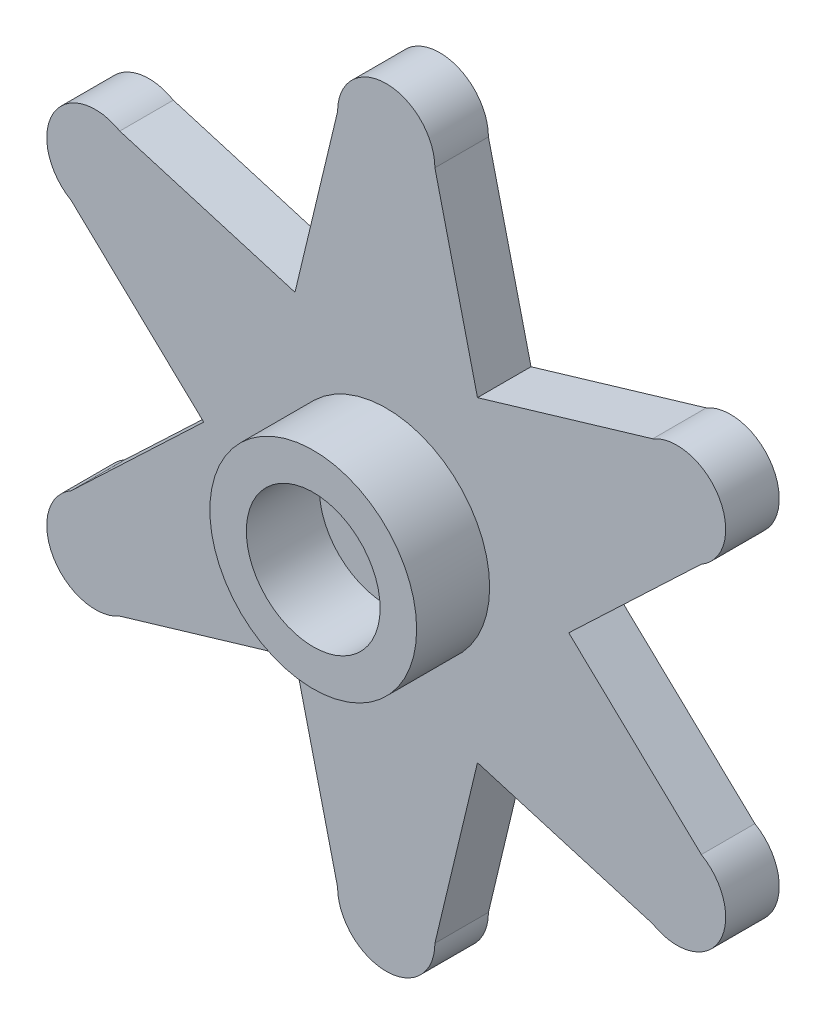
ISO-10303-21;
HEADER;
FILE_DESCRIPTION(('STEP AP214'),'2;1');
FILE_NAME('part.step','',(''),(''),'','','');
FILE_SCHEMA(('AUTOMOTIVE_DESIGN { 1 0 10303 214 1 1 1 1 }'));
ENDSEC;
DATA;
#1=APPLICATION_CONTEXT('core data for automotive mechanical design processes');
#2=APPLICATION_PROTOCOL_DEFINITION('international standard','automotive_design',2000,#1);
#3=PRODUCT_CONTEXT('',#1,'mechanical');
#4=PRODUCT('Part','Part','',(#3));
#5=PRODUCT_RELATED_PRODUCT_CATEGORY('part','',(#4));
#6=PRODUCT_DEFINITION_FORMATION('','',#4);
#7=PRODUCT_DEFINITION_CONTEXT('part definition',#1,'design');
#8=PRODUCT_DEFINITION('design','',#6,#7);
#9=PRODUCT_DEFINITION_SHAPE('','',#8);
#10=(LENGTH_UNIT() NAMED_UNIT(*) SI_UNIT(.MILLI.,.METRE.));
#11=(NAMED_UNIT(*) PLANE_ANGLE_UNIT() SI_UNIT($,.RADIAN.));
#12=(NAMED_UNIT(*) SI_UNIT($,.STERADIAN.) SOLID_ANGLE_UNIT());
#13=UNCERTAINTY_MEASURE_WITH_UNIT(LENGTH_MEASURE(1.E-05),#10,'distance_accuracy_value','');
#14=(GEOMETRIC_REPRESENTATION_CONTEXT(3) GLOBAL_UNCERTAINTY_ASSIGNED_CONTEXT((#13)) GLOBAL_UNIT_ASSIGNED_CONTEXT((#10,
#11,#12)) REPRESENTATION_CONTEXT('',''));
#15=CARTESIAN_POINT('',(0.,0.,0.));
#16=DIRECTION('',(0.,0.,1.));
#17=DIRECTION('',(1.,0.,0.));
#18=AXIS2_PLACEMENT_3D('',#15,#16,#17);
#19=CARTESIAN_POINT('',(11.9511505722253,-6.9,2.2));
#20=DIRECTION('',(0.,0.,-1.));
#21=DIRECTION('',(-1.,0.,0.));
#22=AXIS2_PLACEMENT_3D('',#19,#20,#21);
#23=CYLINDRICAL_SURFACE('',#22,2.);
#24=CARTESIAN_POINT('',(11.9511505722253,-6.9,0.));
#25=DIRECTION('',(0.,0.,-1.));
#26=DIRECTION('',(1.,0.,0.));
#27=AXIS2_PLACEMENT_3D('',#24,#25,#26);
#28=CIRCLE('',#27,2.);
#29=CARTESIAN_POINT('',(12.9511505722253,-5.16794919243113,0.));
#30=VERTEX_POINT('',#29);
#31=CARTESIAN_POINT('',(10.9511505722253,-8.63205080756889,0.));
#32=VERTEX_POINT('',#31);
#33=EDGE_CURVE('E224',#30,#32,#28,.T.);
#34=ORIENTED_EDGE('',*,*,#33,.F.);
#35=DIRECTION('',(0.,0.,-1.));
#36=VECTOR('',#35,1.);
#37=CARTESIAN_POINT('',(12.9511505722253,-5.16794919243113,2.2));
#38=LINE('',#37,#36);
#39=CARTESIAN_POINT('',(12.9511505722253,-5.16794919243113,2.2));
#40=VERTEX_POINT('',#39);
#41=EDGE_CURVE('E19',#40,#30,#38,.T.);
#42=ORIENTED_EDGE('',*,*,#41,.F.);
#43=CARTESIAN_POINT('',(11.9511505722253,-6.9,2.2));
#44=DIRECTION('',(0.,0.,-1.));
#45=DIRECTION('',(1.,0.,0.));
#46=AXIS2_PLACEMENT_3D('',#43,#44,#45);
#47=CIRCLE('',#46,2.);
#48=CARTESIAN_POINT('',(10.9511505722253,-8.63205080756889,2.2));
#49=VERTEX_POINT('',#48);
#50=EDGE_CURVE('E288',#40,#49,#47,.T.);
#51=ORIENTED_EDGE('',*,*,#50,.T.);
#52=DIRECTION('',(0.,0.,-1.));
#53=VECTOR('',#52,1.);
#54=CARTESIAN_POINT('',(10.9511505722253,-8.63205080756889,2.2));
#55=LINE('',#54,#53);
#56=EDGE_CURVE('E39',#49,#32,#55,.T.);
#57=ORIENTED_EDGE('',*,*,#56,.T.);
#58=EDGE_LOOP('',(#34,#42,#51,#57));
#59=FACE_BOUND('',#58,.T.);
#60=ADVANCED_FACE('F16',(#59),#23,.T.);
#61=CARTESIAN_POINT('',(10.2255752861126,-2.58397459621556,2.2));
#62=DIRECTION('',(-0.688004285822964,-0.725706623015964,0.));
#63=DIRECTION('',(0.725706623015964,-0.688004285822964,0.));
#64=AXIS2_PLACEMENT_3D('',#61,#62,#63);
#65=PLANE('',#64);
#66=DIRECTION('',(-0.725706623015964,0.688004285822964,0.));
#67=VECTOR('',#66,1.);
#68=CARTESIAN_POINT('',(10.2255752861126,-2.58397459621556,0.));
#69=LINE('',#68,#67);
#70=CARTESIAN_POINT('',(7.5,0.,0.));
#71=VERTEX_POINT('',#70);
#72=EDGE_CURVE('E227',#30,#71,#69,.T.);
#73=ORIENTED_EDGE('',*,*,#72,.T.);
#74=DIRECTION('',(0.,0.,-1.));
#75=VECTOR('',#74,1.);
#76=CARTESIAN_POINT('',(7.5,0.,2.2));
#77=LINE('',#76,#75);
#78=CARTESIAN_POINT('',(7.5,0.,2.2));
#79=VERTEX_POINT('',#78);
#80=EDGE_CURVE('E333',#79,#71,#77,.T.);
#81=ORIENTED_EDGE('',*,*,#80,.F.);
#82=DIRECTION('',(-0.725706623015964,0.688004285822964,0.));
#83=VECTOR('',#82,1.);
#84=CARTESIAN_POINT('',(10.2255752861126,-2.58397459621556,2.2));
#85=LINE('',#84,#83);
#86=EDGE_CURVE('E345',#40,#79,#85,.T.);
#87=ORIENTED_EDGE('',*,*,#86,.F.);
#88=ORIENTED_EDGE('',*,*,#41,.T.);
#89=EDGE_LOOP('',(#73,#81,#87,#88));
#90=FACE_BOUND('',#89,.T.);
#91=ADVANCED_FACE('F344',(#90),#65,.F.);
#92=CARTESIAN_POINT('',(10.2255752861126,2.58397459621556,2.2));
#93=DIRECTION('',(0.688004285822963,-0.725706623015964,0.));
#94=DIRECTION('',(0.725706623015964,0.688004285822963,0.));
#95=AXIS2_PLACEMENT_3D('',#92,#93,#94);
#96=PLANE('',#95);
#97=DIRECTION('',(-0.725706623015964,-0.688004285822963,0.));
#98=VECTOR('',#97,1.);
#99=CARTESIAN_POINT('',(10.2255752861126,2.58397459621556,0.));
#100=LINE('',#99,#98);
#101=CARTESIAN_POINT('',(12.9511505722253,5.16794919243113,0.));
#102=VERTEX_POINT('',#101);
#103=EDGE_CURVE('E232',#102,#71,#100,.T.);
#104=ORIENTED_EDGE('',*,*,#103,.F.);
#105=DIRECTION('',(0.,0.,-1.));
#106=VECTOR('',#105,1.);
#107=CARTESIAN_POINT('',(12.9511505722253,5.16794919243113,2.2));
#108=LINE('',#107,#106);
#109=CARTESIAN_POINT('',(12.9511505722253,5.16794919243113,2.2));
#110=VERTEX_POINT('',#109);
#111=EDGE_CURVE('E331',#110,#102,#108,.T.);
#112=ORIENTED_EDGE('',*,*,#111,.F.);
#113=DIRECTION('',(-0.725706623015964,-0.688004285822963,0.));
#114=VECTOR('',#113,1.);
#115=CARTESIAN_POINT('',(10.2255752861126,2.58397459621556,2.2));
#116=LINE('',#115,#114);
#117=EDGE_CURVE('E457',#110,#79,#116,.T.);
#118=ORIENTED_EDGE('',*,*,#117,.T.);
#119=ORIENTED_EDGE('',*,*,#80,.T.);
#120=EDGE_LOOP('',(#104,#112,#118,#119));
#121=FACE_BOUND('',#120,.T.);
#122=ADVANCED_FACE('F354',(#121),#96,.T.);
#123=CARTESIAN_POINT('',(11.9511505722253,6.9,2.2));
#124=DIRECTION('',(0.,0.,-1.));
#125=DIRECTION('',(-1.,0.,0.));
#126=AXIS2_PLACEMENT_3D('',#123,#124,#125);
#127=CYLINDRICAL_SURFACE('',#126,2.);
#128=CARTESIAN_POINT('',(11.9511505722253,6.9,0.));
#129=DIRECTION('',(0.,0.,1.));
#130=DIRECTION('',(1.,0.,0.));
#131=AXIS2_PLACEMENT_3D('',#128,#129,#130);
#132=CIRCLE('',#131,2.);
#133=CARTESIAN_POINT('',(10.9511505722253,8.63205080756888,0.));
#134=VERTEX_POINT('',#133);
#135=EDGE_CURVE('E236',#102,#134,#132,.T.);
#136=ORIENTED_EDGE('',*,*,#135,.T.);
#137=DIRECTION('',(0.,0.,-1.));
#138=VECTOR('',#137,1.);
#139=CARTESIAN_POINT('',(10.9511505722253,8.63205080756888,2.2));
#140=LINE('',#139,#138);
#141=CARTESIAN_POINT('',(10.9511505722253,8.63205080756888,2.2));
#142=VERTEX_POINT('',#141);
#143=EDGE_CURVE('E327',#142,#134,#140,.T.);
#144=ORIENTED_EDGE('',*,*,#143,.F.);
#145=CARTESIAN_POINT('',(11.9511505722253,6.9,2.2));
#146=DIRECTION('',(0.,0.,1.));
#147=DIRECTION('',(1.,0.,0.));
#148=AXIS2_PLACEMENT_3D('',#145,#146,#147);
#149=CIRCLE('',#148,2.);
#150=EDGE_CURVE('E460',#110,#142,#149,.T.);
#151=ORIENTED_EDGE('',*,*,#150,.F.);
#152=ORIENTED_EDGE('',*,*,#111,.T.);
#153=EDGE_LOOP('',(#136,#144,#151,#152));
#154=FACE_BOUND('',#153,.T.);
#155=ADVANCED_FACE('F358',(#154),#127,.T.);
#156=CARTESIAN_POINT('',(7.35057528611263,7.56362066797608,2.2));
#157=DIRECTION('',(0.284478228314961,-0.958682500943238,0.));
#158=DIRECTION('',(0.958682500943238,0.284478228314961,0.));
#159=AXIS2_PLACEMENT_3D('',#156,#157,#158);
#160=PLANE('',#159);
#161=DIRECTION('',(-0.958682500943238,-0.284478228314961,0.));
#162=VECTOR('',#161,1.);
#163=CARTESIAN_POINT('',(7.35057528611263,7.56362066797608,0.));
#164=LINE('',#163,#162);
#165=CARTESIAN_POINT('',(3.75,6.49519052838329,0.));
#166=VERTEX_POINT('',#165);
#167=EDGE_CURVE('E239',#134,#166,#164,.T.);
#168=ORIENTED_EDGE('',*,*,#167,.T.);
#169=DIRECTION('',(0.,0.,-1.));
#170=VECTOR('',#169,1.);
#171=CARTESIAN_POINT('',(3.75,6.49519052838329,2.2));
#172=LINE('',#171,#170);
#173=CARTESIAN_POINT('',(3.75,6.49519052838329,2.2));
#174=VERTEX_POINT('',#173);
#175=EDGE_CURVE('E324',#174,#166,#172,.T.);
#176=ORIENTED_EDGE('',*,*,#175,.F.);
#177=DIRECTION('',(-0.958682500943238,-0.284478228314961,0.));
#178=VECTOR('',#177,1.);
#179=CARTESIAN_POINT('',(7.35057528611263,7.56362066797608,2.2));
#180=LINE('',#179,#178);
#181=EDGE_CURVE('E463',#142,#174,#180,.T.);
#182=ORIENTED_EDGE('',*,*,#181,.F.);
#183=ORIENTED_EDGE('',*,*,#143,.T.);
#184=EDGE_LOOP('',(#168,#176,#182,#183));
#185=FACE_BOUND('',#184,.T.);
#186=ADVANCED_FACE('F363',(#185),#160,.F.);
#187=CARTESIAN_POINT('',(2.875,10.1475952641916,2.2));
#188=DIRECTION('',(0.972482514137923,0.232975877927274,0.));
#189=DIRECTION('',(-0.232975877927274,0.972482514137923,0.));
#190=AXIS2_PLACEMENT_3D('',#187,#188,#189);
#191=PLANE('',#190);
#192=DIRECTION('',(0.232975877927274,-0.972482514137923,0.));
#193=VECTOR('',#192,1.);
#194=CARTESIAN_POINT('',(2.875,10.1475952641916,0.));
#195=LINE('',#194,#193);
#196=CARTESIAN_POINT('',(2.,13.8,0.));
#197=VERTEX_POINT('',#196);
#198=EDGE_CURVE('E243',#197,#166,#195,.T.);
#199=ORIENTED_EDGE('',*,*,#198,.F.);
#200=DIRECTION('',(0.,0.,-1.));
#201=VECTOR('',#200,1.);
#202=CARTESIAN_POINT('',(2.,13.8,2.2));
#203=LINE('',#202,#201);
#204=CARTESIAN_POINT('',(2.,13.8,2.2));
#205=VERTEX_POINT('',#204);
#206=EDGE_CURVE('E321',#205,#197,#203,.T.);
#207=ORIENTED_EDGE('',*,*,#206,.F.);
#208=DIRECTION('',(0.232975877927274,-0.972482514137923,0.));
#209=VECTOR('',#208,1.);
#210=CARTESIAN_POINT('',(2.875,10.1475952641916,2.2));
#211=LINE('',#210,#209);
#212=EDGE_CURVE('E466',#205,#174,#211,.T.);
#213=ORIENTED_EDGE('',*,*,#212,.T.);
#214=ORIENTED_EDGE('',*,*,#175,.T.);
#215=EDGE_LOOP('',(#199,#207,#213,#214));
#216=FACE_BOUND('',#215,.T.);
#217=ADVANCED_FACE('F367',(#216),#191,.T.);
#218=CARTESIAN_POINT('',(0.,13.8,2.2));
#219=DIRECTION('',(0.,0.,-1.));
#220=DIRECTION('',(-1.,0.,0.));
#221=AXIS2_PLACEMENT_3D('',#218,#219,#220);
#222=CYLINDRICAL_SURFACE('',#221,2.);
#223=CARTESIAN_POINT('',(0.,13.8,0.));
#224=DIRECTION('',(0.,0.,1.));
#225=DIRECTION('',(1.,0.,0.));
#226=AXIS2_PLACEMENT_3D('',#223,#224,#225);
#227=CIRCLE('',#226,2.);
#228=CARTESIAN_POINT('',(-2.,13.8,0.));
#229=VERTEX_POINT('',#228);
#230=EDGE_CURVE('E247',#197,#229,#227,.T.);
#231=ORIENTED_EDGE('',*,*,#230,.T.);
#232=DIRECTION('',(0.,0.,-1.));
#233=VECTOR('',#232,1.);
#234=CARTESIAN_POINT('',(-2.,13.8,2.2));
#235=LINE('',#234,#233);
#236=CARTESIAN_POINT('',(-2.,13.8,2.2));
#237=VERTEX_POINT('',#236);
#238=EDGE_CURVE('E317',#237,#229,#235,.T.);
#239=ORIENTED_EDGE('',*,*,#238,.F.);
#240=CARTESIAN_POINT('',(0.,13.8,2.2));
#241=DIRECTION('',(0.,0.,1.));
#242=DIRECTION('',(1.,0.,0.));
#243=AXIS2_PLACEMENT_3D('',#240,#241,#242);
#244=CIRCLE('',#243,2.);
#245=EDGE_CURVE('E470',#205,#237,#244,.T.);
#246=ORIENTED_EDGE('',*,*,#245,.F.);
#247=ORIENTED_EDGE('',*,*,#206,.T.);
#248=EDGE_LOOP('',(#231,#239,#246,#247));
#249=FACE_BOUND('',#248,.T.);
#250=ADVANCED_FACE('F371',(#249),#222,.T.);
#251=CARTESIAN_POINT('',(-2.875,10.1475952641916,2.2));
#252=DIRECTION('',(0.972482514137923,-0.232975877927274,0.));
#253=DIRECTION('',(0.232975877927274,0.972482514137923,0.));
#254=AXIS2_PLACEMENT_3D('',#251,#252,#253);
#255=PLANE('',#254);
#256=DIRECTION('',(-0.232975877927274,-0.972482514137923,0.));
#257=VECTOR('',#256,1.);
#258=CARTESIAN_POINT('',(-2.875,10.1475952641916,0.));
#259=LINE('',#258,#257);
#260=CARTESIAN_POINT('',(-3.75,6.49519052838329,0.));
#261=VERTEX_POINT('',#260);
#262=EDGE_CURVE('E250',#229,#261,#259,.T.);
#263=ORIENTED_EDGE('',*,*,#262,.T.);
#264=DIRECTION('',(0.,0.,-1.));
#265=VECTOR('',#264,1.);
#266=CARTESIAN_POINT('',(-3.75,6.49519052838329,2.2));
#267=LINE('',#266,#265);
#268=CARTESIAN_POINT('',(-3.75,6.49519052838329,2.2));
#269=VERTEX_POINT('',#268);
#270=EDGE_CURVE('E314',#269,#261,#267,.T.);
#271=ORIENTED_EDGE('',*,*,#270,.F.);
#272=DIRECTION('',(-0.232975877927274,-0.972482514137923,0.));
#273=VECTOR('',#272,1.);
#274=CARTESIAN_POINT('',(-2.875,10.1475952641916,2.2));
#275=LINE('',#274,#273);
#276=EDGE_CURVE('E473',#237,#269,#275,.T.);
#277=ORIENTED_EDGE('',*,*,#276,.F.);
#278=ORIENTED_EDGE('',*,*,#238,.T.);
#279=EDGE_LOOP('',(#263,#271,#277,#278));
#280=FACE_BOUND('',#279,.T.);
#281=ADVANCED_FACE('F375',(#280),#255,.F.);
#282=CARTESIAN_POINT('',(-7.35057528611262,7.56362066797609,2.2));
#283=DIRECTION('',(0.284478228314961,0.958682500943238,0.));
#284=DIRECTION('',(-0.958682500943238,0.284478228314961,0.));
#285=AXIS2_PLACEMENT_3D('',#282,#283,#284);
#286=PLANE('',#285);
#287=DIRECTION('',(0.958682500943238,-0.284478228314961,0.));
#288=VECTOR('',#287,1.);
#289=CARTESIAN_POINT('',(-7.35057528611262,7.56362066797609,0.));
#290=LINE('',#289,#288);
#291=CARTESIAN_POINT('',(-10.9511505722252,8.63205080756888,0.));
#292=VERTEX_POINT('',#291);
#293=EDGE_CURVE('E254',#292,#261,#290,.T.);
#294=ORIENTED_EDGE('',*,*,#293,.F.);
#295=DIRECTION('',(0.,0.,-1.));
#296=VECTOR('',#295,1.);
#297=CARTESIAN_POINT('',(-10.9511505722252,8.63205080756888,2.2));
#298=LINE('',#297,#296);
#299=CARTESIAN_POINT('',(-10.9511505722252,8.63205080756888,2.2));
#300=VERTEX_POINT('',#299);
#301=EDGE_CURVE('E311',#300,#292,#298,.T.);
#302=ORIENTED_EDGE('',*,*,#301,.F.);
#303=DIRECTION('',(0.958682500943238,-0.284478228314961,0.));
#304=VECTOR('',#303,1.);
#305=CARTESIAN_POINT('',(-7.35057528611262,7.56362066797609,2.2));
#306=LINE('',#305,#304);
#307=EDGE_CURVE('E476',#300,#269,#306,.T.);
#308=ORIENTED_EDGE('',*,*,#307,.T.);
#309=ORIENTED_EDGE('',*,*,#270,.T.);
#310=EDGE_LOOP('',(#294,#302,#308,#309));
#311=FACE_BOUND('',#310,.T.);
#312=ADVANCED_FACE('F379',(#311),#286,.T.);
#313=CARTESIAN_POINT('',(-11.9511505722252,6.9,2.2));
#314=DIRECTION('',(0.,0.,-1.));
#315=DIRECTION('',(-1.,0.,0.));
#316=AXIS2_PLACEMENT_3D('',#313,#314,#315);
#317=CYLINDRICAL_SURFACE('',#316,2.);
#318=CARTESIAN_POINT('',(-11.9511505722252,6.9,0.));
#319=DIRECTION('',(0.,0.,1.));
#320=DIRECTION('',(1.,0.,0.));
#321=AXIS2_PLACEMENT_3D('',#318,#319,#320);
#322=CIRCLE('',#321,2.);
#323=CARTESIAN_POINT('',(-12.9511505722252,5.16794919243113,0.));
#324=VERTEX_POINT('',#323);
#325=EDGE_CURVE('E258',#292,#324,#322,.T.);
#326=ORIENTED_EDGE('',*,*,#325,.T.);
#327=DIRECTION('',(0.,0.,-1.));
#328=VECTOR('',#327,1.);
#329=CARTESIAN_POINT('',(-12.9511505722252,5.16794919243113,2.2));
#330=LINE('',#329,#328);
#331=CARTESIAN_POINT('',(-12.9511505722252,5.16794919243113,2.2));
#332=VERTEX_POINT('',#331);
#333=EDGE_CURVE('E307',#332,#324,#330,.T.);
#334=ORIENTED_EDGE('',*,*,#333,.F.);
#335=CARTESIAN_POINT('',(-11.9511505722252,6.9,2.2));
#336=DIRECTION('',(0.,0.,1.));
#337=DIRECTION('',(1.,0.,0.));
#338=AXIS2_PLACEMENT_3D('',#335,#336,#337);
#339=CIRCLE('',#338,2.);
#340=EDGE_CURVE('E480',#300,#332,#339,.T.);
#341=ORIENTED_EDGE('',*,*,#340,.F.);
#342=ORIENTED_EDGE('',*,*,#301,.T.);
#343=EDGE_LOOP('',(#326,#334,#341,#342));
#344=FACE_BOUND('',#343,.T.);
#345=ADVANCED_FACE('F383',(#344),#317,.T.);
#346=CARTESIAN_POINT('',(-10.2255752861126,2.58397459621556,2.2));
#347=DIRECTION('',(0.688004285822963,0.725706623015964,0.));
#348=DIRECTION('',(-0.725706623015964,0.688004285822963,0.));
#349=AXIS2_PLACEMENT_3D('',#346,#347,#348);
#350=PLANE('',#349);
#351=DIRECTION('',(0.725706623015964,-0.688004285822963,0.));
#352=VECTOR('',#351,1.);
#353=CARTESIAN_POINT('',(-10.2255752861126,2.58397459621556,0.));
#354=LINE('',#353,#352);
#355=CARTESIAN_POINT('',(-7.5,0.,0.));
#356=VERTEX_POINT('',#355);
#357=EDGE_CURVE('E261',#324,#356,#354,.T.);
#358=ORIENTED_EDGE('',*,*,#357,.T.);
#359=DIRECTION('',(0.,0.,-1.));
#360=VECTOR('',#359,1.);
#361=CARTESIAN_POINT('',(-7.5,0.,2.2));
#362=LINE('',#361,#360);
#363=CARTESIAN_POINT('',(-7.5,0.,2.2));
#364=VERTEX_POINT('',#363);
#365=EDGE_CURVE('E304',#364,#356,#362,.T.);
#366=ORIENTED_EDGE('',*,*,#365,.F.);
#367=DIRECTION('',(0.725706623015964,-0.688004285822963,0.));
#368=VECTOR('',#367,1.);
#369=CARTESIAN_POINT('',(-10.2255752861126,2.58397459621556,2.2));
#370=LINE('',#369,#368);
#371=EDGE_CURVE('E483',#332,#364,#370,.T.);
#372=ORIENTED_EDGE('',*,*,#371,.F.);
#373=ORIENTED_EDGE('',*,*,#333,.T.);
#374=EDGE_LOOP('',(#358,#366,#372,#373));
#375=FACE_BOUND('',#374,.T.);
#376=ADVANCED_FACE('F387',(#375),#350,.F.);
#377=CARTESIAN_POINT('',(-10.2255752861126,-2.58397459621556,2.2));
#378=DIRECTION('',(-0.688004285822963,0.725706623015964,0.));
#379=DIRECTION('',(-0.725706623015964,-0.688004285822963,0.));
#380=AXIS2_PLACEMENT_3D('',#377,#378,#379);
#381=PLANE('',#380);
#382=DIRECTION('',(0.725706623015964,0.688004285822963,0.));
#383=VECTOR('',#382,1.);
#384=CARTESIAN_POINT('',(-10.2255752861126,-2.58397459621556,0.));
#385=LINE('',#384,#383);
#386=CARTESIAN_POINT('',(-12.9511505722253,-5.16794919243113,0.));
#387=VERTEX_POINT('',#386);
#388=EDGE_CURVE('E265',#387,#356,#385,.T.);
#389=ORIENTED_EDGE('',*,*,#388,.F.);
#390=DIRECTION('',(0.,0.,-1.));
#391=VECTOR('',#390,1.);
#392=CARTESIAN_POINT('',(-12.9511505722253,-5.16794919243113,2.2));
#393=LINE('',#392,#391);
#394=CARTESIAN_POINT('',(-12.9511505722253,-5.16794919243113,2.2));
#395=VERTEX_POINT('',#394);
#396=EDGE_CURVE('E301',#395,#387,#393,.T.);
#397=ORIENTED_EDGE('',*,*,#396,.F.);
#398=DIRECTION('',(0.725706623015964,0.688004285822963,0.));
#399=VECTOR('',#398,1.);
#400=CARTESIAN_POINT('',(-10.2255752861126,-2.58397459621556,2.2));
#401=LINE('',#400,#399);
#402=EDGE_CURVE('E486',#395,#364,#401,.T.);
#403=ORIENTED_EDGE('',*,*,#402,.T.);
#404=ORIENTED_EDGE('',*,*,#365,.T.);
#405=EDGE_LOOP('',(#389,#397,#403,#404));
#406=FACE_BOUND('',#405,.T.);
#407=ADVANCED_FACE('F391',(#406),#381,.T.);
#408=CARTESIAN_POINT('',(-11.9511505722253,-6.9,2.2));
#409=DIRECTION('',(0.,0.,-1.));
#410=DIRECTION('',(-1.,0.,0.));
#411=AXIS2_PLACEMENT_3D('',#408,#409,#410);
#412=CYLINDRICAL_SURFACE('',#411,2.);
#413=CARTESIAN_POINT('',(-11.9511505722253,-6.9,0.));
#414=DIRECTION('',(0.,0.,-1.));
#415=DIRECTION('',(1.,0.,0.));
#416=AXIS2_PLACEMENT_3D('',#413,#414,#415);
#417=CIRCLE('',#416,2.);
#418=CARTESIAN_POINT('',(-10.9511505722253,-8.63205080756888,0.));
#419=VERTEX_POINT('',#418);
#420=EDGE_CURVE('E269',#419,#387,#417,.T.);
#421=ORIENTED_EDGE('',*,*,#420,.F.);
#422=DIRECTION('',(0.,0.,-1.));
#423=VECTOR('',#422,1.);
#424=CARTESIAN_POINT('',(-10.9511505722253,-8.63205080756888,2.2));
#425=LINE('',#424,#423);
#426=CARTESIAN_POINT('',(-10.9511505722253,-8.63205080756888,2.2));
#427=VERTEX_POINT('',#426);
#428=EDGE_CURVE('E298',#427,#419,#425,.T.);
#429=ORIENTED_EDGE('',*,*,#428,.F.);
#430=CARTESIAN_POINT('',(-11.9511505722253,-6.9,2.2));
#431=DIRECTION('',(0.,0.,-1.));
#432=DIRECTION('',(1.,0.,0.));
#433=AXIS2_PLACEMENT_3D('',#430,#431,#432);
#434=CIRCLE('',#433,2.);
#435=EDGE_CURVE('E490',#427,#395,#434,.T.);
#436=ORIENTED_EDGE('',*,*,#435,.T.);
#437=ORIENTED_EDGE('',*,*,#396,.T.);
#438=EDGE_LOOP('',(#421,#429,#436,#437));
#439=FACE_BOUND('',#438,.T.);
#440=ADVANCED_FACE('F395',(#439),#412,.T.);
#441=CARTESIAN_POINT('',(-7.35057528611263,-7.56362066797609,2.2));
#442=DIRECTION('',(-0.284478228314961,0.958682500943238,0.));
#443=DIRECTION('',(-0.958682500943238,-0.284478228314961,0.));
#444=AXIS2_PLACEMENT_3D('',#441,#442,#443);
#445=PLANE('',#444);
#446=DIRECTION('',(0.958682500943238,0.284478228314961,0.));
#447=VECTOR('',#446,1.);
#448=CARTESIAN_POINT('',(-7.35057528611263,-7.56362066797609,0.));
#449=LINE('',#448,#447);
#450=CARTESIAN_POINT('',(-3.75,-6.49519052838329,0.));
#451=VERTEX_POINT('',#450);
#452=EDGE_CURVE('E273',#419,#451,#449,.T.);
#453=ORIENTED_EDGE('',*,*,#452,.T.);
#454=DIRECTION('',(0.,0.,-1.));
#455=VECTOR('',#454,1.);
#456=CARTESIAN_POINT('',(-3.75,-6.49519052838329,2.2));
#457=LINE('',#456,#455);
#458=CARTESIAN_POINT('',(-3.75,-6.49519052838329,2.2));
#459=VERTEX_POINT('',#458);
#460=EDGE_CURVE('E295',#459,#451,#457,.T.);
#461=ORIENTED_EDGE('',*,*,#460,.F.);
#462=DIRECTION('',(0.958682500943238,0.284478228314961,0.));
#463=VECTOR('',#462,1.);
#464=CARTESIAN_POINT('',(-7.35057528611263,-7.56362066797609,2.2));
#465=LINE('',#464,#463);
#466=EDGE_CURVE('E218',#427,#459,#465,.T.);
#467=ORIENTED_EDGE('',*,*,#466,.F.);
#468=ORIENTED_EDGE('',*,*,#428,.T.);
#469=EDGE_LOOP('',(#453,#461,#467,#468));
#470=FACE_BOUND('',#469,.T.);
#471=ADVANCED_FACE('F399',(#470),#445,.F.);
#472=CARTESIAN_POINT('',(-2.875,-10.1475952641916,2.2));
#473=DIRECTION('',(-0.972482514137923,-0.232975877927274,0.));
#474=DIRECTION('',(0.232975877927274,-0.972482514137923,0.));
#475=AXIS2_PLACEMENT_3D('',#472,#473,#474);
#476=PLANE('',#475);
#477=DIRECTION('',(-0.232975877927274,0.972482514137923,0.));
#478=VECTOR('',#477,1.);
#479=CARTESIAN_POINT('',(-2.875,-10.1475952641916,0.));
#480=LINE('',#479,#478);
#481=CARTESIAN_POINT('',(-2.,-13.8,0.));
#482=VERTEX_POINT('',#481);
#483=EDGE_CURVE('E277',#482,#451,#480,.T.);
#484=ORIENTED_EDGE('',*,*,#483,.F.);
#485=DIRECTION('',(0.,0.,-1.));
#486=VECTOR('',#485,1.);
#487=CARTESIAN_POINT('',(-2.,-13.8,2.2));
#488=LINE('',#487,#486);
#489=CARTESIAN_POINT('',(-2.,-13.8,2.2));
#490=VERTEX_POINT('',#489);
#491=EDGE_CURVE('E198',#490,#482,#488,.T.);
#492=ORIENTED_EDGE('',*,*,#491,.F.);
#493=DIRECTION('',(-0.232975877927274,0.972482514137923,0.));
#494=VECTOR('',#493,1.);
#495=CARTESIAN_POINT('',(-2.875,-10.1475952641916,2.2));
#496=LINE('',#495,#494);
#497=EDGE_CURVE('E211',#490,#459,#496,.T.);
#498=ORIENTED_EDGE('',*,*,#497,.T.);
#499=ORIENTED_EDGE('',*,*,#460,.T.);
#500=EDGE_LOOP('',(#484,#492,#498,#499));
#501=FACE_BOUND('',#500,.T.);
#502=ADVANCED_FACE('F403',(#501),#476,.T.);
#503=CARTESIAN_POINT('',(0.,-13.8,2.2));
#504=DIRECTION('',(0.,0.,-1.));
#505=DIRECTION('',(-1.,0.,0.));
#506=AXIS2_PLACEMENT_3D('',#503,#504,#505);
#507=CYLINDRICAL_SURFACE('',#506,2.);
#508=CARTESIAN_POINT('',(0.,-13.8,0.));
#509=DIRECTION('',(0.,0.,-1.));
#510=DIRECTION('',(1.,0.,0.));
#511=AXIS2_PLACEMENT_3D('',#508,#509,#510);
#512=CIRCLE('',#511,2.);
#513=CARTESIAN_POINT('',(2.,-13.8,0.));
#514=VERTEX_POINT('',#513);
#515=EDGE_CURVE('E194',#514,#482,#512,.T.);
#516=ORIENTED_EDGE('',*,*,#515,.F.);
#517=DIRECTION('',(0.,0.,-1.));
#518=VECTOR('',#517,1.);
#519=CARTESIAN_POINT('',(2.,-13.8,2.2));
#520=LINE('',#519,#518);
#521=CARTESIAN_POINT('',(2.,-13.8,2.2));
#522=VERTEX_POINT('',#521);
#523=EDGE_CURVE('E188',#522,#514,#520,.T.);
#524=ORIENTED_EDGE('',*,*,#523,.F.);
#525=CARTESIAN_POINT('',(0.,-13.8,2.2));
#526=DIRECTION('',(0.,0.,-1.));
#527=DIRECTION('',(1.,0.,0.));
#528=AXIS2_PLACEMENT_3D('',#525,#526,#527);
#529=CIRCLE('',#528,2.);
#530=EDGE_CURVE('E192',#522,#490,#529,.T.);
#531=ORIENTED_EDGE('',*,*,#530,.T.);
#532=ORIENTED_EDGE('',*,*,#491,.T.);
#533=EDGE_LOOP('',(#516,#524,#531,#532));
#534=FACE_BOUND('',#533,.T.);
#535=ADVANCED_FACE('F190',(#534),#507,.T.);
#536=CARTESIAN_POINT('',(2.875,-10.1475952641916,2.2));
#537=DIRECTION('',(-0.972482514137923,0.232975877927274,0.));
#538=DIRECTION('',(-0.232975877927274,-0.972482514137923,0.));
#539=AXIS2_PLACEMENT_3D('',#536,#537,#538);
#540=PLANE('',#539);
#541=DIRECTION('',(0.232975877927274,0.972482514137923,0.));
#542=VECTOR('',#541,1.);
#543=CARTESIAN_POINT('',(2.875,-10.1475952641916,0.));
#544=LINE('',#543,#542);
#545=CARTESIAN_POINT('',(3.75,-6.49519052838329,0.));
#546=VERTEX_POINT('',#545);
#547=EDGE_CURVE('E282',#514,#546,#544,.T.);
#548=ORIENTED_EDGE('',*,*,#547,.T.);
#549=DIRECTION('',(0.,0.,-1.));
#550=VECTOR('',#549,1.);
#551=CARTESIAN_POINT('',(3.75,-6.49519052838329,2.2));
#552=LINE('',#551,#550);
#553=CARTESIAN_POINT('',(3.75,-6.49519052838329,2.2));
#554=VERTEX_POINT('',#553);
#555=EDGE_CURVE('E115',#554,#546,#552,.T.);
#556=ORIENTED_EDGE('',*,*,#555,.F.);
#557=DIRECTION('',(0.232975877927274,0.972482514137923,0.));
#558=VECTOR('',#557,1.);
#559=CARTESIAN_POINT('',(2.875,-10.1475952641916,2.2));
#560=LINE('',#559,#558);
#561=EDGE_CURVE('E200',#522,#554,#560,.T.);
#562=ORIENTED_EDGE('',*,*,#561,.F.);
#563=ORIENTED_EDGE('',*,*,#523,.T.);
#564=EDGE_LOOP('',(#548,#556,#562,#563));
#565=FACE_BOUND('',#564,.T.);
#566=ADVANCED_FACE('F201',(#565),#540,.F.);
#567=CARTESIAN_POINT('',(7.35057528611263,-7.56362066797609,2.2));
#568=DIRECTION('',(-0.284478228314961,-0.958682500943238,0.));
#569=DIRECTION('',(0.958682500943238,-0.284478228314961,0.));
#570=AXIS2_PLACEMENT_3D('',#567,#568,#569);
#571=PLANE('',#570);
#572=DIRECTION('',(-0.958682500943238,0.284478228314961,0.));
#573=VECTOR('',#572,1.);
#574=CARTESIAN_POINT('',(7.35057528611263,-7.56362066797609,0.));
#575=LINE('',#574,#573);
#576=EDGE_CURVE('E284',#32,#546,#575,.T.);
#577=ORIENTED_EDGE('',*,*,#576,.F.);
#578=ORIENTED_EDGE('',*,*,#56,.F.);
#579=DIRECTION('',(-0.958682500943238,0.284478228314961,0.));
#580=VECTOR('',#579,1.);
#581=CARTESIAN_POINT('',(7.35057528611263,-7.56362066797609,2.2));
#582=LINE('',#581,#580);
#583=EDGE_CURVE('E205',#49,#554,#582,.T.);
#584=ORIENTED_EDGE('',*,*,#583,.T.);
#585=ORIENTED_EDGE('',*,*,#555,.T.);
#586=EDGE_LOOP('',(#577,#578,#584,#585));
#587=FACE_BOUND('',#586,.T.);
#588=ADVANCED_FACE('F412',(#587),#571,.T.);
#589=CARTESIAN_POINT('',(0.,0.,2.2));
#590=DIRECTION('',(0.,0.,1.));
#591=DIRECTION('',(1.,0.,0.));
#592=AXIS2_PLACEMENT_3D('',#589,#590,#591);
#593=PLANE('',#592);
#594=CARTESIAN_POINT('',(0.,0.,2.2));
#595=DIRECTION('',(0.,0.,1.));
#596=DIRECTION('',(1.,0.,0.));
#597=AXIS2_PLACEMENT_3D('',#594,#595,#596);
#598=CIRCLE('',#597,4.25);
#599=CARTESIAN_POINT('',(4.25,0.,2.2));
#600=VERTEX_POINT('',#599);
#601=EDGE_CURVE('E10',#600,#600,#598,.T.);
#602=ORIENTED_EDGE('',*,*,#601,.F.);
#603=EDGE_LOOP('',(#602));
#604=FACE_BOUND('',#603,.T.);
#605=ORIENTED_EDGE('',*,*,#50,.F.);
#606=ORIENTED_EDGE('',*,*,#86,.T.);
#607=ORIENTED_EDGE('',*,*,#117,.F.);
#608=ORIENTED_EDGE('',*,*,#150,.T.);
#609=ORIENTED_EDGE('',*,*,#181,.T.);
#610=ORIENTED_EDGE('',*,*,#212,.F.);
#611=ORIENTED_EDGE('',*,*,#245,.T.);
#612=ORIENTED_EDGE('',*,*,#276,.T.);
#613=ORIENTED_EDGE('',*,*,#307,.F.);
#614=ORIENTED_EDGE('',*,*,#340,.T.);
#615=ORIENTED_EDGE('',*,*,#371,.T.);
#616=ORIENTED_EDGE('',*,*,#402,.F.);
#617=ORIENTED_EDGE('',*,*,#435,.F.);
#618=ORIENTED_EDGE('',*,*,#466,.T.);
#619=ORIENTED_EDGE('',*,*,#497,.F.);
#620=ORIENTED_EDGE('',*,*,#530,.F.);
#621=ORIENTED_EDGE('',*,*,#561,.T.);
#622=ORIENTED_EDGE('',*,*,#583,.F.);
#623=EDGE_LOOP('',(#605,#606,#607,#608,#609,#610,#611,#612,#613,#614,#615,#616,#617,#618,#619,
#620,#621,#622));
#624=FACE_BOUND('',#623,.T.);
#625=ADVANCED_FACE('F209',(#604,#624),#593,.T.);
#626=CARTESIAN_POINT('',(0.,0.,0.));
#627=DIRECTION('',(0.,0.,1.));
#628=DIRECTION('',(1.,0.,0.));
#629=AXIS2_PLACEMENT_3D('',#626,#627,#628);
#630=PLANE('',#629);
#631=ORIENTED_EDGE('',*,*,#33,.T.);
#632=ORIENTED_EDGE('',*,*,#576,.T.);
#633=ORIENTED_EDGE('',*,*,#547,.F.);
#634=ORIENTED_EDGE('',*,*,#515,.T.);
#635=ORIENTED_EDGE('',*,*,#483,.T.);
#636=ORIENTED_EDGE('',*,*,#452,.F.);
#637=ORIENTED_EDGE('',*,*,#420,.T.);
#638=ORIENTED_EDGE('',*,*,#388,.T.);
#639=ORIENTED_EDGE('',*,*,#357,.F.);
#640=ORIENTED_EDGE('',*,*,#325,.F.);
#641=ORIENTED_EDGE('',*,*,#293,.T.);
#642=ORIENTED_EDGE('',*,*,#262,.F.);
#643=ORIENTED_EDGE('',*,*,#230,.F.);
#644=ORIENTED_EDGE('',*,*,#198,.T.);
#645=ORIENTED_EDGE('',*,*,#167,.F.);
#646=ORIENTED_EDGE('',*,*,#135,.F.);
#647=ORIENTED_EDGE('',*,*,#103,.T.);
#648=ORIENTED_EDGE('',*,*,#72,.F.);
#649=EDGE_LOOP('',(#631,#632,#633,#634,#635,#636,#637,#638,#639,#640,#641,#642,#643,#644,#645,
#646,#647,#648));
#650=FACE_BOUND('',#649,.T.);
#651=ADVANCED_FACE('F347',(#650),#630,.F.);
#652=CARTESIAN_POINT('',(0.,0.,5.2));
#653=DIRECTION('',(0.,0.,-1.));
#654=DIRECTION('',(-1.,0.,0.));
#655=AXIS2_PLACEMENT_3D('',#652,#653,#654);
#656=CYLINDRICAL_SURFACE('',#655,2.75);
#657=CARTESIAN_POINT('',(0.,0.,5.2));
#658=DIRECTION('',(0.,0.,1.));
#659=DIRECTION('',(1.,0.,0.));
#660=AXIS2_PLACEMENT_3D('',#657,#658,#659);
#661=CIRCLE('',#660,2.75);
#662=CARTESIAN_POINT('',(2.75,0.,5.2));
#663=VERTEX_POINT('',#662);
#664=EDGE_CURVE('E439',#663,#663,#661,.T.);
#665=ORIENTED_EDGE('',*,*,#664,.T.);
#666=EDGE_LOOP('',(#665));
#667=FACE_BOUND('',#666,.T.);
#668=CARTESIAN_POINT('',(0.,0.,2.2));
#669=DIRECTION('',(0.,0.,1.));
#670=DIRECTION('',(1.,0.,0.));
#671=AXIS2_PLACEMENT_3D('',#668,#669,#670);
#672=CIRCLE('',#671,2.75);
#673=CARTESIAN_POINT('',(2.75,0.,2.2));
#674=VERTEX_POINT('',#673);
#675=EDGE_CURVE('E447',#674,#674,#672,.T.);
#676=ORIENTED_EDGE('',*,*,#675,.F.);
#677=EDGE_LOOP('',(#676));
#678=FACE_BOUND('',#677,.T.);
#679=ADVANCED_FACE('F417',(#667,#678),#656,.F.);
#680=CARTESIAN_POINT('',(0.,0.,5.2));
#681=DIRECTION('',(0.,0.,-1.));
#682=DIRECTION('',(-1.,0.,0.));
#683=AXIS2_PLACEMENT_3D('',#680,#681,#682);
#684=CYLINDRICAL_SURFACE('',#683,4.25);
#685=CARTESIAN_POINT('',(0.,0.,5.2));
#686=DIRECTION('',(0.,0.,1.));
#687=DIRECTION('',(1.,0.,0.));
#688=AXIS2_PLACEMENT_3D('',#685,#686,#687);
#689=CIRCLE('',#688,4.25);
#690=CARTESIAN_POINT('',(4.25,0.,5.2));
#691=VERTEX_POINT('',#690);
#692=EDGE_CURVE('E228',#691,#691,#689,.T.);
#693=ORIENTED_EDGE('',*,*,#692,.F.);
#694=EDGE_LOOP('',(#693));
#695=FACE_BOUND('',#694,.T.);
#696=ORIENTED_EDGE('',*,*,#601,.T.);
#697=EDGE_LOOP('',(#696));
#698=FACE_BOUND('',#697,.T.);
#699=ADVANCED_FACE('F424',(#695,#698),#684,.T.);
#700=CARTESIAN_POINT('',(0.,0.,5.2));
#701=DIRECTION('',(0.,0.,1.));
#702=DIRECTION('',(1.,0.,0.));
#703=AXIS2_PLACEMENT_3D('',#700,#701,#702);
#704=PLANE('',#703);
#705=ORIENTED_EDGE('',*,*,#664,.F.);
#706=EDGE_LOOP('',(#705));
#707=FACE_BOUND('',#706,.T.);
#708=ORIENTED_EDGE('',*,*,#692,.T.);
#709=EDGE_LOOP('',(#708));
#710=FACE_BOUND('',#709,.T.);
#711=ADVANCED_FACE('F428',(#707,#710),#704,.T.);
#712=ORIENTED_EDGE('',*,*,#675,.T.);
#713=EDGE_LOOP('',(#712));
#714=FACE_BOUND('',#713,.T.);
#715=ADVANCED_FACE('F421',(#714),#593,.T.);
#716=CLOSED_SHELL('',(#60,#91,#122,#155,#186,#217,#250,#281,#312,#345,#376,#407,#440,#471,#502,
#535,#566,#588,#625,#651,#679,#699,#711,#715));
#717=MANIFOLD_SOLID_BREP('B1',#716);
#718=ADVANCED_BREP_SHAPE_REPRESENTATION('',(#18,#717),#14);
#719=SHAPE_DEFINITION_REPRESENTATION(#9,#718);
ENDSEC;
END-ISO-10303-21;
